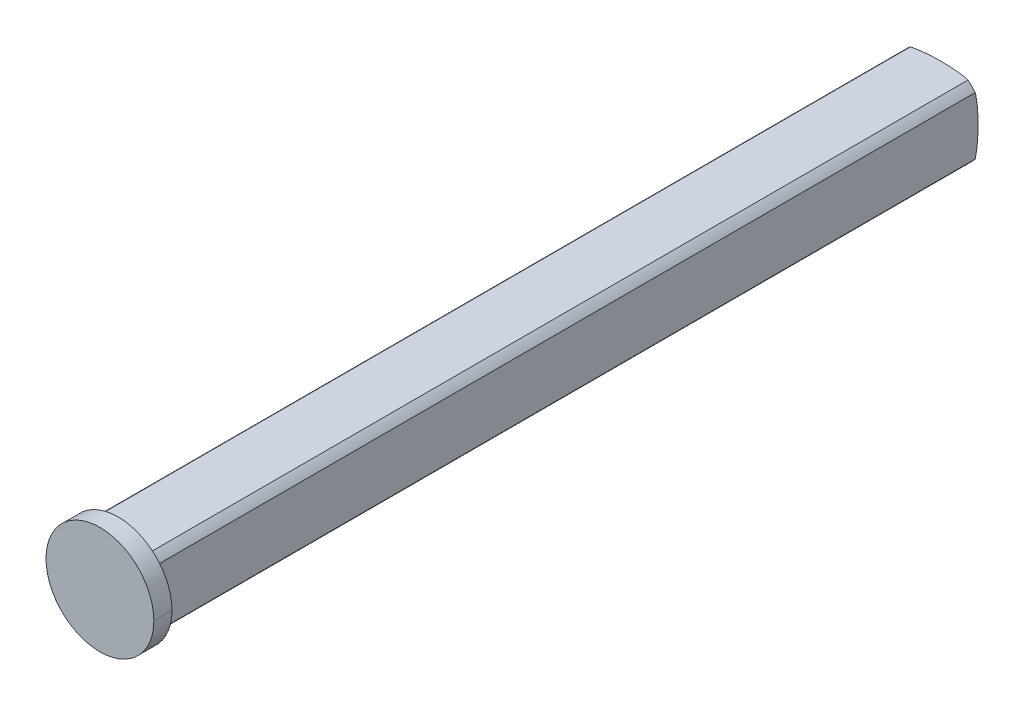
ISO-10303-21;
HEADER;
FILE_DESCRIPTION(('STEP AP214'),'2;1');
FILE_NAME('part.step','',(''),(''),'','','');
FILE_SCHEMA(('AUTOMOTIVE_DESIGN { 1 0 10303 214 1 1 1 1 }'));
ENDSEC;
DATA;
#1=APPLICATION_CONTEXT('core data for automotive mechanical design processes');
#2=APPLICATION_PROTOCOL_DEFINITION('international standard','automotive_design',2000,#1);
#3=PRODUCT_CONTEXT('',#1,'mechanical');
#4=PRODUCT('Part','Part','',(#3));
#5=PRODUCT_RELATED_PRODUCT_CATEGORY('part','',(#4));
#6=PRODUCT_DEFINITION_FORMATION('','',#4);
#7=PRODUCT_DEFINITION_CONTEXT('part definition',#1,'design');
#8=PRODUCT_DEFINITION('design','',#6,#7);
#9=PRODUCT_DEFINITION_SHAPE('','',#8);
#10=(LENGTH_UNIT() NAMED_UNIT(*) SI_UNIT(.MILLI.,.METRE.));
#11=(NAMED_UNIT(*) PLANE_ANGLE_UNIT() SI_UNIT($,.RADIAN.));
#12=(NAMED_UNIT(*) SI_UNIT($,.STERADIAN.) SOLID_ANGLE_UNIT());
#13=UNCERTAINTY_MEASURE_WITH_UNIT(LENGTH_MEASURE(1.E-05),#10,'distance_accuracy_value','');
#14=(GEOMETRIC_REPRESENTATION_CONTEXT(3) GLOBAL_UNCERTAINTY_ASSIGNED_CONTEXT((#13)) GLOBAL_UNIT_ASSIGNED_CONTEXT((#10,
#11,#12)) REPRESENTATION_CONTEXT('',''));
#15=CARTESIAN_POINT('',(0.,0.,0.));
#16=DIRECTION('',(0.,0.,1.));
#17=DIRECTION('',(1.,0.,0.));
#18=AXIS2_PLACEMENT_3D('',#15,#16,#17);
#19=CARTESIAN_POINT('',(0.,0.,0.));
#20=DIRECTION('',(0.,0.,1.));
#21=DIRECTION('',(1.,0.,0.));
#22=AXIS2_PLACEMENT_3D('',#19,#20,#21);
#23=PLANE('',#22);
#24=CARTESIAN_POINT('',(0.,0.,0.));
#25=DIRECTION('',(0.,0.,1.));
#26=DIRECTION('',(1.,0.,0.));
#27=AXIS2_PLACEMENT_3D('',#24,#25,#26);
#28=CIRCLE('',#27,2.375);
#29=CARTESIAN_POINT('',(-2.375,0.,0.));
#30=VERTEX_POINT('',#29);
#31=CARTESIAN_POINT('',(2.375,0.,0.));
#32=VERTEX_POINT('',#31);
#33=EDGE_CURVE('P0_E11',#30,#32,#28,.T.);
#34=ORIENTED_EDGE('',*,*,#33,.F.);
#35=CARTESIAN_POINT('',(0.,0.,0.));
#36=DIRECTION('',(0.,0.,1.));
#37=DIRECTION('',(1.,0.,0.));
#38=AXIS2_PLACEMENT_3D('',#35,#36,#37);
#39=CIRCLE('',#38,2.375);
#40=EDGE_CURVE('P0_E70',#32,#30,#39,.T.);
#41=ORIENTED_EDGE('',*,*,#40,.F.);
#42=EDGE_LOOP('',(#34,#41));
#43=FACE_BOUND('',#42,.T.);
#44=ADVANCED_FACE('P0_F17',(#43),#23,.F.);
#45=CARTESIAN_POINT('',(0.,0.,0.8));
#46=DIRECTION('',(0.,0.,1.));
#47=DIRECTION('',(1.,0.,0.));
#48=AXIS2_PLACEMENT_3D('',#45,#46,#47);
#49=PLANE('',#48);
#50=CARTESIAN_POINT('',(0.,0.,0.8));
#51=DIRECTION('',(0.,0.,1.));
#52=DIRECTION('',(1.,0.,0.));
#53=AXIS2_PLACEMENT_3D('',#50,#51,#52);
#54=CIRCLE('',#53,2.375);
#55=CARTESIAN_POINT('',(-2.375,0.,0.8));
#56=VERTEX_POINT('',#55);
#57=CARTESIAN_POINT('',(2.375,0.,0.8));
#58=VERTEX_POINT('',#57);
#59=EDGE_CURVE('P0_E30',#56,#58,#54,.T.);
#60=ORIENTED_EDGE('',*,*,#59,.T.);
#61=CARTESIAN_POINT('',(0.,0.,0.8));
#62=DIRECTION('',(0.,0.,1.));
#63=DIRECTION('',(1.,0.,0.));
#64=AXIS2_PLACEMENT_3D('',#61,#62,#63);
#65=CIRCLE('',#64,2.375);
#66=EDGE_CURVE('P0_E21',#58,#56,#65,.T.);
#67=ORIENTED_EDGE('',*,*,#66,.T.);
#68=EDGE_LOOP('',(#60,#67));
#69=FACE_BOUND('',#68,.T.);
#70=ADVANCED_FACE('P0_F19',(#69),#49,.T.);
#71=CARTESIAN_POINT('',(0.,0.,0.8));
#72=DIRECTION('',(0.,0.,-1.));
#73=DIRECTION('',(-1.,0.,0.));
#74=AXIS2_PLACEMENT_3D('',#71,#72,#73);
#75=CYLINDRICAL_SURFACE('',#74,2.375);
#76=DIRECTION('',(0.,0.,-1.));
#77=VECTOR('',#76,1.);
#78=CARTESIAN_POINT('',(2.375,0.,0.8));
#79=LINE('',#78,#77);
#80=EDGE_CURVE('P0_E62',#58,#32,#79,.T.);
#81=ORIENTED_EDGE('',*,*,#80,.F.);
#82=ORIENTED_EDGE('',*,*,#59,.F.);
#83=DIRECTION('',(0.,0.,-1.));
#84=VECTOR('',#83,1.);
#85=CARTESIAN_POINT('',(-2.375,0.,0.8));
#86=LINE('',#85,#84);
#87=EDGE_CURVE('P0_E56',#56,#30,#86,.T.);
#88=ORIENTED_EDGE('',*,*,#87,.T.);
#89=ORIENTED_EDGE('',*,*,#33,.T.);
#90=EDGE_LOOP('',(#81,#82,#88,#89));
#91=FACE_BOUND('',#90,.T.);
#92=ADVANCED_FACE('P0_F64',(#91),#75,.T.);
#93=CARTESIAN_POINT('',(0.,0.,0.8));
#94=DIRECTION('',(0.,0.,-1.));
#95=DIRECTION('',(-1.,0.,0.));
#96=AXIS2_PLACEMENT_3D('',#93,#94,#95);
#97=CYLINDRICAL_SURFACE('',#96,2.375);
#98=ORIENTED_EDGE('',*,*,#66,.F.);
#99=ORIENTED_EDGE('',*,*,#80,.T.);
#100=ORIENTED_EDGE('',*,*,#40,.T.);
#101=ORIENTED_EDGE('',*,*,#87,.F.);
#102=EDGE_LOOP('',(#98,#99,#100,#101));
#103=FACE_BOUND('',#102,.T.);
#104=ADVANCED_FACE('P0_F67',(#103),#97,.T.);
#105=CLOSED_SHELL('',(#44,#70,#92,#104));
#106=MANIFOLD_SOLID_BREP('P0_B1',#105);
#107=CARTESIAN_POINT('',(0.,0.,-36.322));
#108=DIRECTION('',(0.,0.,1.));
#109=DIRECTION('',(1.,0.,0.));
#110=AXIS2_PLACEMENT_3D('',#107,#108,#109);
#111=CYLINDRICAL_SURFACE('',#110,2.032);
#112=DIRECTION('',(0.,0.,-1.));
#113=VECTOR('',#112,1.);
#114=CARTESIAN_POINT('',(1.5875,1.26841150657032,-36.322));
#115=LINE('',#114,#113);
#116=CARTESIAN_POINT('',(1.5875,1.26841150657032,0.));
#117=VERTEX_POINT('',#116);
#118=CARTESIAN_POINT('',(1.5875,1.26841150657032,-36.170919142098));
#119=VERTEX_POINT('',#118);
#120=EDGE_CURVE('P1_E142',#117,#119,#115,.T.);
#121=ORIENTED_EDGE('',*,*,#120,.T.);
#122=CARTESIAN_POINT('',(0.,0.,-36.170919142098));
#123=DIRECTION('',(0.,0.,1.));
#124=DIRECTION('',(1.,0.,0.));
#125=AXIS2_PLACEMENT_3D('',#122,#123,#124);
#126=CIRCLE('',#125,2.032);
#127=CARTESIAN_POINT('',(1.26841150657032,1.5875,-36.170919142098));
#128=VERTEX_POINT('',#127);
#129=EDGE_CURVE('P1_E139',#119,#128,#126,.T.);
#130=ORIENTED_EDGE('',*,*,#129,.T.);
#131=DIRECTION('',(0.,0.,1.));
#132=VECTOR('',#131,1.);
#133=CARTESIAN_POINT('',(1.26841150657032,1.5875,-36.322));
#134=LINE('',#133,#132);
#135=CARTESIAN_POINT('',(1.26841150657032,1.5875,0.));
#136=VERTEX_POINT('',#135);
#137=EDGE_CURVE('P1_E126',#128,#136,#134,.T.);
#138=ORIENTED_EDGE('',*,*,#137,.T.);
#139=CARTESIAN_POINT('',(0.,0.,0.));
#140=DIRECTION('',(0.,0.,1.));
#141=DIRECTION('',(1.,0.,0.));
#142=AXIS2_PLACEMENT_3D('',#139,#140,#141);
#143=CIRCLE('',#142,2.032);
#144=EDGE_CURVE('P1_E339',#117,#136,#143,.T.);
#145=ORIENTED_EDGE('',*,*,#144,.F.);
#146=EDGE_LOOP('',(#121,#130,#138,#145));
#147=FACE_BOUND('',#146,.T.);
#148=ADVANCED_FACE('P1_F16',(#147),#111,.T.);
#149=CARTESIAN_POINT('',(0.,0.,-36.322));
#150=DIRECTION('',(0.,0.,1.));
#151=DIRECTION('',(1.,0.,0.));
#152=AXIS2_PLACEMENT_3D('',#149,#150,#151);
#153=CYLINDRICAL_SURFACE('',#152,2.032);
#154=DIRECTION('',(0.,0.,1.));
#155=VECTOR('',#154,1.);
#156=CARTESIAN_POINT('',(-1.5875,1.26841150657032,-36.322));
#157=LINE('',#156,#155);
#158=CARTESIAN_POINT('',(-1.5875,1.26841150657032,-36.170919142098));
#159=VERTEX_POINT('',#158);
#160=CARTESIAN_POINT('',(-1.5875,1.26841150657032,0.));
#161=VERTEX_POINT('',#160);
#162=EDGE_CURVE('P1_E188',#159,#161,#157,.T.);
#163=ORIENTED_EDGE('',*,*,#162,.T.);
#164=CARTESIAN_POINT('',(0.,0.,0.));
#165=DIRECTION('',(0.,0.,1.));
#166=DIRECTION('',(1.,0.,0.));
#167=AXIS2_PLACEMENT_3D('',#164,#165,#166);
#168=CIRCLE('',#167,2.032);
#169=CARTESIAN_POINT('',(-1.26841150657032,1.5875,0.));
#170=VERTEX_POINT('',#169);
#171=EDGE_CURVE('P1_E45',#170,#161,#168,.T.);
#172=ORIENTED_EDGE('',*,*,#171,.F.);
#173=DIRECTION('',(0.,0.,-1.));
#174=VECTOR('',#173,1.);
#175=CARTESIAN_POINT('',(-1.26841150657032,1.5875,-36.322));
#176=LINE('',#175,#174);
#177=CARTESIAN_POINT('',(-1.26841150657032,1.5875,-36.170919142098));
#178=VERTEX_POINT('',#177);
#179=EDGE_CURVE('P1_E119',#170,#178,#176,.T.);
#180=ORIENTED_EDGE('',*,*,#179,.T.);
#181=CARTESIAN_POINT('',(0.,0.,-36.170919142098));
#182=DIRECTION('',(0.,0.,1.));
#183=DIRECTION('',(1.,0.,0.));
#184=AXIS2_PLACEMENT_3D('',#181,#182,#183);
#185=CIRCLE('',#184,2.032);
#186=EDGE_CURVE('P1_E153',#178,#159,#185,.T.);
#187=ORIENTED_EDGE('',*,*,#186,.T.);
#188=EDGE_LOOP('',(#163,#172,#180,#187));
#189=FACE_BOUND('',#188,.T.);
#190=ADVANCED_FACE('P1_F298',(#189),#153,.T.);
#191=CARTESIAN_POINT('',(0.,0.,-36.322));
#192=DIRECTION('',(0.,0.,1.));
#193=DIRECTION('',(1.,0.,0.));
#194=AXIS2_PLACEMENT_3D('',#191,#192,#193);
#195=CYLINDRICAL_SURFACE('',#194,2.032);
#196=DIRECTION('',(0.,0.,-1.));
#197=VECTOR('',#196,1.);
#198=CARTESIAN_POINT('',(-1.5875,-1.26841150657032,-36.322));
#199=LINE('',#198,#197);
#200=CARTESIAN_POINT('',(-1.5875,-1.26841150657032,0.));
#201=VERTEX_POINT('',#200);
#202=CARTESIAN_POINT('',(-1.5875,-1.26841150657032,-36.170919142098));
#203=VERTEX_POINT('',#202);
#204=EDGE_CURVE('P1_E204',#201,#203,#199,.T.);
#205=ORIENTED_EDGE('',*,*,#204,.T.);
#206=CARTESIAN_POINT('',(0.,0.,-36.170919142098));
#207=DIRECTION('',(0.,0.,1.));
#208=DIRECTION('',(1.,0.,0.));
#209=AXIS2_PLACEMENT_3D('',#206,#207,#208);
#210=CIRCLE('',#209,2.032);
#211=CARTESIAN_POINT('',(-1.26841150657032,-1.5875,-36.170919142098));
#212=VERTEX_POINT('',#211);
#213=EDGE_CURVE('P1_E10',#203,#212,#210,.T.);
#214=ORIENTED_EDGE('',*,*,#213,.T.);
#215=DIRECTION('',(0.,0.,1.));
#216=VECTOR('',#215,1.);
#217=CARTESIAN_POINT('',(-1.26841150657032,-1.5875,-36.322));
#218=LINE('',#217,#216);
#219=CARTESIAN_POINT('',(-1.26841150657032,-1.5875,0.));
#220=VERTEX_POINT('',#219);
#221=EDGE_CURVE('P1_E380',#212,#220,#218,.T.);
#222=ORIENTED_EDGE('',*,*,#221,.T.);
#223=CARTESIAN_POINT('',(0.,0.,0.));
#224=DIRECTION('',(0.,0.,1.));
#225=DIRECTION('',(1.,0.,0.));
#226=AXIS2_PLACEMENT_3D('',#223,#224,#225);
#227=CIRCLE('',#226,2.032);
#228=EDGE_CURVE('P1_E90',#201,#220,#227,.T.);
#229=ORIENTED_EDGE('',*,*,#228,.F.);
#230=EDGE_LOOP('',(#205,#214,#222,#229));
#231=FACE_BOUND('',#230,.T.);
#232=ADVANCED_FACE('P1_F251',(#231),#195,.T.);
#233=CARTESIAN_POINT('',(0.,0.,-36.322));
#234=DIRECTION('',(0.,0.,1.));
#235=DIRECTION('',(1.,0.,0.));
#236=AXIS2_PLACEMENT_3D('',#233,#234,#235);
#237=CYLINDRICAL_SURFACE('',#236,2.032);
#238=DIRECTION('',(0.,0.,-1.));
#239=VECTOR('',#238,1.);
#240=CARTESIAN_POINT('',(1.26841150657032,-1.5875,-36.322));
#241=LINE('',#240,#239);
#242=CARTESIAN_POINT('',(1.26841150657032,-1.5875,0.));
#243=VERTEX_POINT('',#242);
#244=CARTESIAN_POINT('',(1.26841150657032,-1.5875,-36.170919142098));
#245=VERTEX_POINT('',#244);
#246=EDGE_CURVE('P1_E329',#243,#245,#241,.T.);
#247=ORIENTED_EDGE('',*,*,#246,.T.);
#248=CARTESIAN_POINT('',(0.,0.,-36.170919142098));
#249=DIRECTION('',(0.,0.,1.));
#250=DIRECTION('',(1.,0.,0.));
#251=AXIS2_PLACEMENT_3D('',#248,#249,#250);
#252=CIRCLE('',#251,2.032);
#253=CARTESIAN_POINT('',(1.5875,-1.26841150657032,-36.170919142098));
#254=VERTEX_POINT('',#253);
#255=EDGE_CURVE('P1_E30',#245,#254,#252,.T.);
#256=ORIENTED_EDGE('',*,*,#255,.T.);
#257=DIRECTION('',(0.,0.,1.));
#258=VECTOR('',#257,1.);
#259=CARTESIAN_POINT('',(1.5875,-1.26841150657032,-36.322));
#260=LINE('',#259,#258);
#261=CARTESIAN_POINT('',(1.5875,-1.26841150657032,0.));
#262=VERTEX_POINT('',#261);
#263=EDGE_CURVE('P1_E320',#254,#262,#260,.T.);
#264=ORIENTED_EDGE('',*,*,#263,.T.);
#265=CARTESIAN_POINT('',(0.,0.,0.));
#266=DIRECTION('',(0.,0.,1.));
#267=DIRECTION('',(1.,0.,0.));
#268=AXIS2_PLACEMENT_3D('',#265,#266,#267);
#269=CIRCLE('',#268,2.032);
#270=EDGE_CURVE('P1_E341',#243,#262,#269,.T.);
#271=ORIENTED_EDGE('',*,*,#270,.F.);
#272=EDGE_LOOP('',(#247,#256,#264,#271));
#273=FACE_BOUND('',#272,.T.);
#274=ADVANCED_FACE('P1_F18',(#273),#237,.T.);
#275=CARTESIAN_POINT('',(-1.5875,1.5875,-36.322));
#276=DIRECTION('',(0.,0.,-1.));
#277=DIRECTION('',(0.,-1.,0.));
#278=AXIS2_PLACEMENT_3D('',#275,#276,#277);
#279=PLANE('',#278);
#280=CARTESIAN_POINT('',(0.,0.,-36.322));
#281=DIRECTION('',(0.,0.,1.));
#282=DIRECTION('',(1.,0.,0.));
#283=AXIS2_PLACEMENT_3D('',#280,#281,#282);
#284=CIRCLE('',#283,1.24506403026729);
#285=CARTESIAN_POINT('',(1.24506403026729,0.,-36.322));
#286=VERTEX_POINT('',#285);
#287=CARTESIAN_POINT('',(-1.24506403026729,0.,-36.322));
#288=VERTEX_POINT('',#287);
#289=EDGE_CURVE('P1_E279',#286,#288,#284,.T.);
#290=ORIENTED_EDGE('',*,*,#289,.F.);
#291=CARTESIAN_POINT('',(0.,0.,-36.322));
#292=DIRECTION('',(0.,0.,1.));
#293=DIRECTION('',(1.,0.,0.));
#294=AXIS2_PLACEMENT_3D('',#291,#292,#293);
#295=CIRCLE('',#294,1.24506403026729);
#296=EDGE_CURVE('P1_E331',#288,#286,#295,.T.);
#297=ORIENTED_EDGE('',*,*,#296,.F.);
#298=EDGE_LOOP('',(#290,#297));
#299=FACE_BOUND('',#298,.T.);
#300=ADVANCED_FACE('P1_F253',(#299),#279,.T.);
#301=CARTESIAN_POINT('',(0.,0.,-34.197));
#302=DIRECTION('',(0.,0.,1.));
#303=DIRECTION('',(1.,0.,0.));
#304=AXIS2_PLACEMENT_3D('',#301,#302,#303);
#305=DEGENERATE_TOROIDAL_SURFACE('',#304,1.24506403026729,2.125,.T.);
#306=CARTESIAN_POINT('',(-1.24506403026729,0.,-34.197));
#307=DIRECTION('',(0.,1.,0.));
#308=DIRECTION('',(-1.,0.,0.));
#309=AXIS2_PLACEMENT_3D('',#306,#307,#308);
#310=CIRCLE('',#309,2.125);
#311=CARTESIAN_POINT('',(-1.5875,0.,-36.2942273616929));
#312=VERTEX_POINT('',#311);
#313=EDGE_CURVE('P1_E268',#288,#312,#310,.T.);
#314=ORIENTED_EDGE('',*,*,#313,.F.);
#315=ORIENTED_EDGE('',*,*,#296,.T.);
#316=CARTESIAN_POINT('',(1.24506403026729,0.,-34.197));
#317=DIRECTION('',(0.,-1.,0.));
#318=DIRECTION('',(0.,0.,-1.));
#319=AXIS2_PLACEMENT_3D('',#316,#317,#318);
#320=CIRCLE('',#319,2.125);
#321=CARTESIAN_POINT('',(1.5875,0.,-36.2942273616929));
#322=VERTEX_POINT('',#321);
#323=EDGE_CURVE('P1_E197',#286,#322,#320,.T.);
#324=ORIENTED_EDGE('',*,*,#323,.T.);
#325=CARTESIAN_POINT('',(1.5875,-1.26841150657032,-36.170919142098));
#326=CARTESIAN_POINT('',(1.5875,-0.987077094901351,-36.2409306391377));
#327=CARTESIAN_POINT('',(1.5875,-0.63953045901757,-36.2701819538896));
#328=CARTESIAN_POINT('',(1.5875,-0.353837297484624,-36.2942273616929));
#329=CARTESIAN_POINT('',(1.5875,0.,-36.2942273616929));
#330=B_SPLINE_CURVE_WITH_KNOTS('',2,(#325,#326,#327,#328,#329),.UNSPECIFIED.,.F.,.F.,(3,2,3),
(0.,0.5,1.),.UNSPECIFIED.);
#331=EDGE_CURVE('P1_E313',#254,#322,#330,.T.);
#332=ORIENTED_EDGE('',*,*,#331,.F.);
#333=ORIENTED_EDGE('',*,*,#255,.F.);
#334=CARTESIAN_POINT('',(-1.26841150657032,-1.5875,-36.170919142098));
#335=CARTESIAN_POINT('',(-0.770338232179697,-1.5875,-36.2948672057874));
#336=CARTESIAN_POINT('',(0.00849337593367507,-1.5875,-36.2942236517903));
#337=CARTESIAN_POINT('',(0.775470990428885,-1.5875,-36.2935898928308));
#338=CARTESIAN_POINT('',(1.26841150657033,-1.5875,-36.170919142098));
#339=B_SPLINE_CURVE_WITH_KNOTS('',2,(#334,#335,#336,#337,#338),.UNSPECIFIED.,.F.,.F.,(3,2,3),
(0.,0.5,1.),.UNSPECIFIED.);
#340=EDGE_CURVE('P1_E223',#212,#245,#339,.T.);
#341=ORIENTED_EDGE('',*,*,#340,.F.);
#342=ORIENTED_EDGE('',*,*,#213,.F.);
#343=CARTESIAN_POINT('',(-1.5875,0.,-36.2942273616929));
#344=CARTESIAN_POINT('',(-1.5875,-0.35317995737028,-36.2942273616929));
#345=CARTESIAN_POINT('',(-1.5875,-0.639529322286498,-36.2701820494506));
#346=CARTESIAN_POINT('',(-1.5875,-0.986669843225587,-36.241031985785));
#347=CARTESIAN_POINT('',(-1.5875,-1.26841150657032,-36.170919142098));
#348=B_SPLINE_CURVE_WITH_KNOTS('',2,(#343,#344,#345,#346,#347),.UNSPECIFIED.,.F.,.F.,(3,2,3),
(0.,0.5,1.),.UNSPECIFIED.);
#349=EDGE_CURVE('P1_E198',#312,#203,#348,.T.);
#350=ORIENTED_EDGE('',*,*,#349,.F.);
#351=EDGE_LOOP('',(#314,#315,#324,#332,#333,#341,#342,#350));
#352=FACE_BOUND('',#351,.T.);
#353=ADVANCED_FACE('P1_F239',(#352),#305,.T.);
#354=CARTESIAN_POINT('',(-1.5875,1.5875,0.));
#355=DIRECTION('',(0.,0.,-1.));
#356=DIRECTION('',(0.,-1.,0.));
#357=AXIS2_PLACEMENT_3D('',#354,#355,#356);
#358=PLANE('',#357);
#359=ORIENTED_EDGE('',*,*,#171,.T.);
#360=DIRECTION('',(0.,-1.,0.));
#361=VECTOR('',#360,1.);
#362=CARTESIAN_POINT('',(-1.5875,-1.5875,0.));
#363=LINE('',#362,#361);
#364=EDGE_CURVE('P1_E284',#161,#201,#363,.T.);
#365=ORIENTED_EDGE('',*,*,#364,.T.);
#366=ORIENTED_EDGE('',*,*,#228,.T.);
#367=DIRECTION('',(1.,0.,0.));
#368=VECTOR('',#367,1.);
#369=CARTESIAN_POINT('',(-1.5875,-1.5875,0.));
#370=LINE('',#369,#368);
#371=EDGE_CURVE('P1_E322',#220,#243,#370,.T.);
#372=ORIENTED_EDGE('',*,*,#371,.T.);
#373=ORIENTED_EDGE('',*,*,#270,.T.);
#374=DIRECTION('',(0.,1.,0.));
#375=VECTOR('',#374,1.);
#376=CARTESIAN_POINT('',(1.5875,-1.5875,0.));
#377=LINE('',#376,#375);
#378=EDGE_CURVE('P1_E140',#262,#117,#377,.T.);
#379=ORIENTED_EDGE('',*,*,#378,.T.);
#380=ORIENTED_EDGE('',*,*,#144,.T.);
#381=DIRECTION('',(-1.,0.,0.));
#382=VECTOR('',#381,1.);
#383=CARTESIAN_POINT('',(-1.5875,1.5875,0.));
#384=LINE('',#383,#382);
#385=EDGE_CURVE('P1_E133',#136,#170,#384,.T.);
#386=ORIENTED_EDGE('',*,*,#385,.T.);
#387=EDGE_LOOP('',(#359,#365,#366,#372,#373,#379,#380,#386));
#388=FACE_BOUND('',#387,.T.);
#389=ADVANCED_FACE('P1_F249',(#388),#358,.F.);
#390=CARTESIAN_POINT('',(-1.5875,1.5875,0.));
#391=DIRECTION('',(0.,-1.,0.));
#392=DIRECTION('',(0.,0.,-1.));
#393=AXIS2_PLACEMENT_3D('',#390,#391,#392);
#394=PLANE('',#393);
#395=ORIENTED_EDGE('',*,*,#137,.F.);
#396=CARTESIAN_POINT('',(1.26841150657033,1.5875,-36.170919142098));
#397=CARTESIAN_POINT('',(0.770338232179695,1.5875,-36.2948672057874));
#398=CARTESIAN_POINT('',(-0.00849337593367984,1.5875,-36.2942236517903));
#399=CARTESIAN_POINT('',(-0.775470990428856,1.5875,-36.2935898928308));
#400=CARTESIAN_POINT('',(-1.26841150657032,1.5875,-36.170919142098));
#401=B_SPLINE_CURVE_WITH_KNOTS('',2,(#396,#397,#398,#399,#400),.UNSPECIFIED.,.F.,.F.,(3,2,3),
(0.,0.5,1.),.UNSPECIFIED.);
#402=EDGE_CURVE('P1_E131',#128,#178,#401,.T.);
#403=ORIENTED_EDGE('',*,*,#402,.T.);
#404=ORIENTED_EDGE('',*,*,#179,.F.);
#405=ORIENTED_EDGE('',*,*,#385,.F.);
#406=EDGE_LOOP('',(#395,#403,#404,#405));
#407=FACE_BOUND('',#406,.T.);
#408=ADVANCED_FACE('P1_F127',(#407),#394,.F.);
#409=CARTESIAN_POINT('',(1.5875,-1.5875,0.));
#410=DIRECTION('',(-1.,0.,0.));
#411=DIRECTION('',(0.,0.,1.));
#412=AXIS2_PLACEMENT_3D('',#409,#410,#411);
#413=PLANE('',#412);
#414=ORIENTED_EDGE('',*,*,#263,.F.);
#415=ORIENTED_EDGE('',*,*,#331,.T.);
#416=CARTESIAN_POINT('',(1.5875,0.,-36.2942273616929));
#417=CARTESIAN_POINT('',(1.5875,0.353179957392105,-36.2942273616929));
#418=CARTESIAN_POINT('',(1.5875,0.6395293222865,-36.2701820494506));
#419=CARTESIAN_POINT('',(1.5875,0.98666984323891,-36.2410319857817));
#420=CARTESIAN_POINT('',(1.5875,1.26841150657033,-36.170919142098));
#421=B_SPLINE_CURVE_WITH_KNOTS('',2,(#416,#417,#418,#419,#420),.UNSPECIFIED.,.F.,.F.,(3,2,3),
(0.,0.5,1.),.UNSPECIFIED.);
#422=EDGE_CURVE('P1_E150',#322,#119,#421,.T.);
#423=ORIENTED_EDGE('',*,*,#422,.T.);
#424=ORIENTED_EDGE('',*,*,#120,.F.);
#425=ORIENTED_EDGE('',*,*,#378,.F.);
#426=EDGE_LOOP('',(#414,#415,#423,#424,#425));
#427=FACE_BOUND('',#426,.T.);
#428=ADVANCED_FACE('P1_F295',(#427),#413,.F.);
#429=CARTESIAN_POINT('',(-1.5875,-1.5875,0.));
#430=DIRECTION('',(0.,1.,0.));
#431=DIRECTION('',(1.,0.,0.));
#432=AXIS2_PLACEMENT_3D('',#429,#430,#431);
#433=PLANE('',#432);
#434=ORIENTED_EDGE('',*,*,#221,.F.);
#435=ORIENTED_EDGE('',*,*,#340,.T.);
#436=ORIENTED_EDGE('',*,*,#246,.F.);
#437=ORIENTED_EDGE('',*,*,#371,.F.);
#438=EDGE_LOOP('',(#434,#435,#436,#437));
#439=FACE_BOUND('',#438,.T.);
#440=ADVANCED_FACE('P1_F175',(#439),#433,.F.);
#441=CARTESIAN_POINT('',(-1.5875,-1.5875,0.));
#442=DIRECTION('',(1.,0.,0.));
#443=DIRECTION('',(0.,1.,0.));
#444=AXIS2_PLACEMENT_3D('',#441,#442,#443);
#445=PLANE('',#444);
#446=ORIENTED_EDGE('',*,*,#162,.F.);
#447=CARTESIAN_POINT('',(-1.5875,1.26841150657033,-36.170919142098));
#448=CARTESIAN_POINT('',(-1.5875,0.98707709490135,-36.2409306391377));
#449=CARTESIAN_POINT('',(-1.5875,0.63953045901757,-36.2701819538896));
#450=CARTESIAN_POINT('',(-1.5875,0.353837297484625,-36.2942273616929));
#451=CARTESIAN_POINT('',(-1.5875,0.,-36.2942273616929));
#452=B_SPLINE_CURVE_WITH_KNOTS('',2,(#447,#448,#449,#450,#451),.UNSPECIFIED.,.F.,.F.,(3,2,3),
(0.,0.5,1.),.UNSPECIFIED.);
#453=EDGE_CURVE('P1_E280',#159,#312,#452,.T.);
#454=ORIENTED_EDGE('',*,*,#453,.T.);
#455=ORIENTED_EDGE('',*,*,#349,.T.);
#456=ORIENTED_EDGE('',*,*,#204,.F.);
#457=ORIENTED_EDGE('',*,*,#364,.F.);
#458=EDGE_LOOP('',(#446,#454,#455,#456,#457));
#459=FACE_BOUND('',#458,.T.);
#460=ADVANCED_FACE('P1_F174',(#459),#445,.F.);
#461=CARTESIAN_POINT('',(0.,0.,-34.197));
#462=DIRECTION('',(0.,0.,1.));
#463=DIRECTION('',(1.,0.,0.));
#464=AXIS2_PLACEMENT_3D('',#461,#462,#463);
#465=DEGENERATE_TOROIDAL_SURFACE('',#464,1.24506403026729,2.125,.T.);
#466=ORIENTED_EDGE('',*,*,#289,.T.);
#467=ORIENTED_EDGE('',*,*,#313,.T.);
#468=ORIENTED_EDGE('',*,*,#453,.F.);
#469=ORIENTED_EDGE('',*,*,#186,.F.);
#470=ORIENTED_EDGE('',*,*,#402,.F.);
#471=ORIENTED_EDGE('',*,*,#129,.F.);
#472=ORIENTED_EDGE('',*,*,#422,.F.);
#473=ORIENTED_EDGE('',*,*,#323,.F.);
#474=EDGE_LOOP('',(#466,#467,#468,#469,#470,#471,#472,#473));
#475=FACE_BOUND('',#474,.T.);
#476=ADVANCED_FACE('P1_F151',(#475),#465,.T.);
#477=CLOSED_SHELL('',(#148,#190,#232,#274,#300,#353,#389,#408,#428,#440,#460,#476));
#478=MANIFOLD_SOLID_BREP('P1_B1',#477);
#479=ADVANCED_BREP_SHAPE_REPRESENTATION('',(#18,#106,#478),#14);
#480=SHAPE_DEFINITION_REPRESENTATION(#9,#479);
ENDSEC;
END-ISO-10303-21;
